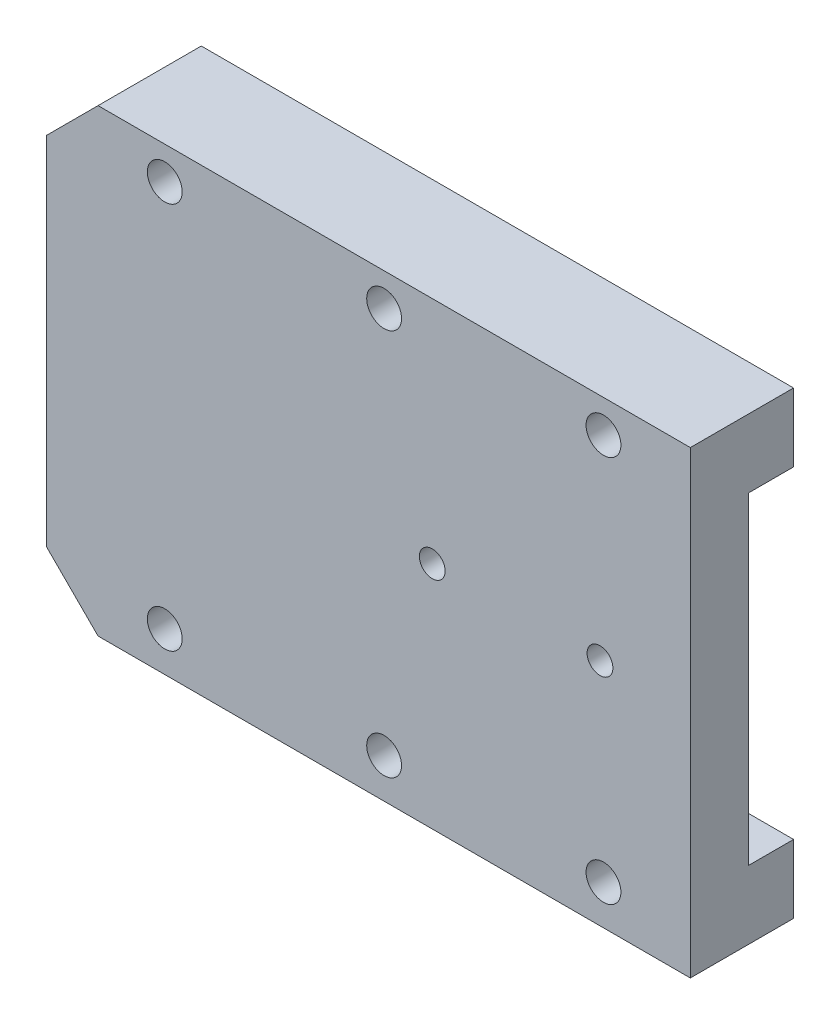
ISO-10303-21;
HEADER;
FILE_DESCRIPTION(('STEP AP214'),'2;1');
FILE_NAME('part.step','',(''),(''),'','','');
FILE_SCHEMA(('AUTOMOTIVE_DESIGN { 1 0 10303 214 1 1 1 1 }'));
ENDSEC;
DATA;
#1=APPLICATION_CONTEXT('core data for automotive mechanical design processes');
#2=APPLICATION_PROTOCOL_DEFINITION('international standard','automotive_design',2000,#1);
#3=PRODUCT_CONTEXT('',#1,'mechanical');
#4=PRODUCT('Part','Part','',(#3));
#5=PRODUCT_RELATED_PRODUCT_CATEGORY('part','',(#4));
#6=PRODUCT_DEFINITION_FORMATION('','',#4);
#7=PRODUCT_DEFINITION_CONTEXT('part definition',#1,'design');
#8=PRODUCT_DEFINITION('design','',#6,#7);
#9=PRODUCT_DEFINITION_SHAPE('','',#8);
#10=(LENGTH_UNIT() NAMED_UNIT(*) SI_UNIT(.MILLI.,.METRE.));
#11=(NAMED_UNIT(*) PLANE_ANGLE_UNIT() SI_UNIT($,.RADIAN.));
#12=(NAMED_UNIT(*) SI_UNIT($,.STERADIAN.) SOLID_ANGLE_UNIT());
#13=UNCERTAINTY_MEASURE_WITH_UNIT(LENGTH_MEASURE(1.E-05),#10,'distance_accuracy_value','');
#14=(GEOMETRIC_REPRESENTATION_CONTEXT(3) GLOBAL_UNCERTAINTY_ASSIGNED_CONTEXT((#13)) GLOBAL_UNIT_ASSIGNED_CONTEXT((#10,
#11,#12)) REPRESENTATION_CONTEXT('',''));
#15=CARTESIAN_POINT('',(0.,0.,0.));
#16=DIRECTION('',(0.,0.,1.));
#17=DIRECTION('',(1.,0.,0.));
#18=AXIS2_PLACEMENT_3D('',#15,#16,#17);
#19=CARTESIAN_POINT('',(0.,0.,-4.));
#20=DIRECTION('',(0.,0.,-1.));
#21=DIRECTION('',(-1.,0.,0.));
#22=AXIS2_PLACEMENT_3D('',#19,#20,#21);
#23=PLANE('',#22);
#24=DIRECTION('',(-1.,0.,0.));
#25=VECTOR('',#24,1.);
#26=CARTESIAN_POINT('',(22.5,12.5,-4.));
#27=LINE('',#26,#25);
#28=CARTESIAN_POINT('',(22.5,12.5,-4.));
#29=VERTEX_POINT('',#28);
#30=CARTESIAN_POINT('',(-27.4,12.5,-4.));
#31=VERTEX_POINT('',#30);
#32=EDGE_CURVE('E186',#29,#31,#27,.T.);
#33=ORIENTED_EDGE('',*,*,#32,.T.);
#34=DIRECTION('',(0.,1.,0.));
#35=VECTOR('',#34,1.);
#36=CARTESIAN_POINT('',(-27.4,17.8,-4.));
#37=LINE('',#36,#35);
#38=CARTESIAN_POINT('',(-27.4,13.8,-4.));
#39=VERTEX_POINT('',#38);
#40=EDGE_CURVE('E189',#31,#39,#37,.T.);
#41=ORIENTED_EDGE('',*,*,#40,.T.);
#42=DIRECTION('',(0.707106781186549,0.707106781186546,0.));
#43=VECTOR('',#42,1.);
#44=CARTESIAN_POINT('',(-20.6,20.6,-4.));
#45=LINE('',#44,#43);
#46=CARTESIAN_POINT('',(-23.4,17.8,-4.));
#47=VERTEX_POINT('',#46);
#48=EDGE_CURVE('E159',#39,#47,#45,.T.);
#49=ORIENTED_EDGE('',*,*,#48,.T.);
#50=DIRECTION('',(-1.,0.,0.));
#51=VECTOR('',#50,1.);
#52=CARTESIAN_POINT('',(22.5,17.8,-4.));
#53=LINE('',#52,#51);
#54=CARTESIAN_POINT('',(22.5,17.8,-4.));
#55=VERTEX_POINT('',#54);
#56=EDGE_CURVE('E137',#55,#47,#53,.T.);
#57=ORIENTED_EDGE('',*,*,#56,.F.);
#58=DIRECTION('',(0.,1.,0.));
#59=VECTOR('',#58,1.);
#60=CARTESIAN_POINT('',(22.5,17.8,-4.));
#61=LINE('',#60,#59);
#62=EDGE_CURVE('E138',#29,#55,#61,.T.);
#63=ORIENTED_EDGE('',*,*,#62,.F.);
#64=EDGE_LOOP('',(#33,#41,#49,#57,#63));
#65=FACE_BOUND('',#64,.T.);
#66=CARTESIAN_POINT('',(-18.2306151546301,15.2670988528399,-4.));
#67=DIRECTION('',(0.,0.,-1.));
#68=DIRECTION('',(-1.,0.,0.));
#69=AXIS2_PLACEMENT_3D('',#66,#67,#68);
#70=CIRCLE('',#69,1.35);
#71=CARTESIAN_POINT('',(-19.5806151546301,15.2670988528399,-4.));
#72=VERTEX_POINT('',#71);
#73=EDGE_CURVE('E206',#72,#72,#70,.T.);
#74=ORIENTED_EDGE('',*,*,#73,.F.);
#75=EDGE_LOOP('',(#74));
#76=FACE_BOUND('',#75,.T.);
#77=CARTESIAN_POINT('',(-1.23061515463011,15.2670988528399,-4.));
#78=DIRECTION('',(0.,0.,-1.));
#79=DIRECTION('',(-1.,0.,0.));
#80=AXIS2_PLACEMENT_3D('',#77,#78,#79);
#81=CIRCLE('',#80,1.35);
#82=CARTESIAN_POINT('',(-2.58061515463011,15.2670988528399,-4.));
#83=VERTEX_POINT('',#82);
#84=EDGE_CURVE('E200',#83,#83,#81,.T.);
#85=ORIENTED_EDGE('',*,*,#84,.F.);
#86=EDGE_LOOP('',(#85));
#87=FACE_BOUND('',#86,.T.);
#88=CARTESIAN_POINT('',(15.7693848453699,15.2670988528398,-4.));
#89=DIRECTION('',(0.,0.,-1.));
#90=DIRECTION('',(-1.,0.,0.));
#91=AXIS2_PLACEMENT_3D('',#88,#89,#90);
#92=CIRCLE('',#91,1.35);
#93=CARTESIAN_POINT('',(14.4193848453699,15.2670988528398,-4.));
#94=VERTEX_POINT('',#93);
#95=EDGE_CURVE('E195',#94,#94,#92,.T.);
#96=ORIENTED_EDGE('',*,*,#95,.F.);
#97=EDGE_LOOP('',(#96));
#98=FACE_BOUND('',#97,.T.);
#99=ADVANCED_FACE('F32',(#65,#76,#87,#98),#23,.T.);
#100=CARTESIAN_POINT('',(22.5,-17.8,4.));
#101=DIRECTION('',(0.,1.,0.));
#102=DIRECTION('',(-1.,0.,0.));
#103=AXIS2_PLACEMENT_3D('',#100,#101,#102);
#104=PLANE('',#103);
#105=DIRECTION('',(1.,0.,0.));
#106=VECTOR('',#105,1.);
#107=CARTESIAN_POINT('',(22.5,-17.8,4.));
#108=LINE('',#107,#106);
#109=CARTESIAN_POINT('',(-23.4,-17.8,4.));
#110=VERTEX_POINT('',#109);
#111=CARTESIAN_POINT('',(22.5,-17.8,4.));
#112=VERTEX_POINT('',#111);
#113=EDGE_CURVE('E141',#110,#112,#108,.T.);
#114=ORIENTED_EDGE('',*,*,#113,.F.);
#115=DIRECTION('',(0.,0.,-1.));
#116=VECTOR('',#115,1.);
#117=CARTESIAN_POINT('',(-23.4,-17.8,-4.));
#118=LINE('',#117,#116);
#119=CARTESIAN_POINT('',(-23.4,-17.8,-4.));
#120=VERTEX_POINT('',#119);
#121=EDGE_CURVE('E11',#110,#120,#118,.T.);
#122=ORIENTED_EDGE('',*,*,#121,.T.);
#123=DIRECTION('',(1.,0.,0.));
#124=VECTOR('',#123,1.);
#125=CARTESIAN_POINT('',(22.5,-17.8,-4.));
#126=LINE('',#125,#124);
#127=CARTESIAN_POINT('',(22.5,-17.8,-4.));
#128=VERTEX_POINT('',#127);
#129=EDGE_CURVE('E143',#120,#128,#126,.T.);
#130=ORIENTED_EDGE('',*,*,#129,.T.);
#131=DIRECTION('',(0.,0.,-1.));
#132=VECTOR('',#131,1.);
#133=CARTESIAN_POINT('',(22.5,-17.8,4.));
#134=LINE('',#133,#132);
#135=EDGE_CURVE('E136',#112,#128,#134,.T.);
#136=ORIENTED_EDGE('',*,*,#135,.F.);
#137=EDGE_LOOP('',(#114,#122,#130,#136));
#138=FACE_BOUND('',#137,.T.);
#139=ADVANCED_FACE('F254',(#138),#104,.F.);
#140=CARTESIAN_POINT('',(22.5,17.8,4.));
#141=DIRECTION('',(-1.,0.,0.));
#142=DIRECTION('',(0.,0.,1.));
#143=AXIS2_PLACEMENT_3D('',#140,#141,#142);
#144=PLANE('',#143);
#145=DIRECTION('',(0.,1.,0.));
#146=VECTOR('',#145,1.);
#147=CARTESIAN_POINT('',(22.5,12.5,-0.5));
#148=LINE('',#147,#146);
#149=CARTESIAN_POINT('',(22.5,-12.5,-0.499999999999997));
#150=VERTEX_POINT('',#149);
#151=CARTESIAN_POINT('',(22.5,12.5,-0.5));
#152=VERTEX_POINT('',#151);
#153=EDGE_CURVE('E118',#150,#152,#148,.T.);
#154=ORIENTED_EDGE('',*,*,#153,.T.);
#155=DIRECTION('',(0.,0.,-1.));
#156=VECTOR('',#155,1.);
#157=CARTESIAN_POINT('',(22.5,12.5,-0.5));
#158=LINE('',#157,#156);
#159=EDGE_CURVE('E130',#152,#29,#158,.T.);
#160=ORIENTED_EDGE('',*,*,#159,.T.);
#161=ORIENTED_EDGE('',*,*,#62,.T.);
#162=DIRECTION('',(0.,0.,-1.));
#163=VECTOR('',#162,1.);
#164=CARTESIAN_POINT('',(22.5,17.8,4.));
#165=LINE('',#164,#163);
#166=CARTESIAN_POINT('',(22.5,17.8,4.));
#167=VERTEX_POINT('',#166);
#168=EDGE_CURVE('E147',#167,#55,#165,.T.);
#169=ORIENTED_EDGE('',*,*,#168,.F.);
#170=DIRECTION('',(0.,1.,0.));
#171=VECTOR('',#170,1.);
#172=CARTESIAN_POINT('',(22.5,17.8,4.));
#173=LINE('',#172,#171);
#174=EDGE_CURVE('E233',#112,#167,#173,.T.);
#175=ORIENTED_EDGE('',*,*,#174,.F.);
#176=ORIENTED_EDGE('',*,*,#135,.T.);
#177=CARTESIAN_POINT('',(22.5,-12.5,-4.));
#178=VERTEX_POINT('',#177);
#179=EDGE_CURVE('E127',#128,#178,#61,.T.);
#180=ORIENTED_EDGE('',*,*,#179,.T.);
#181=DIRECTION('',(0.,0.,1.));
#182=VECTOR('',#181,1.);
#183=CARTESIAN_POINT('',(22.5,-12.5,-0.499999999999997));
#184=LINE('',#183,#182);
#185=EDGE_CURVE('E111',#178,#150,#184,.T.);
#186=ORIENTED_EDGE('',*,*,#185,.T.);
#187=EDGE_LOOP('',(#154,#160,#161,#169,#175,#176,#180,#186));
#188=FACE_BOUND('',#187,.T.);
#189=ADVANCED_FACE('F133',(#188),#144,.F.);
#190=CARTESIAN_POINT('',(22.5,17.8,4.));
#191=DIRECTION('',(0.,-1.,0.));
#192=DIRECTION('',(1.,0.,0.));
#193=AXIS2_PLACEMENT_3D('',#190,#191,#192);
#194=PLANE('',#193);
#195=ORIENTED_EDGE('',*,*,#56,.T.);
#196=DIRECTION('',(0.,0.,1.));
#197=VECTOR('',#196,1.);
#198=CARTESIAN_POINT('',(-23.4,17.8,4.));
#199=LINE('',#198,#197);
#200=CARTESIAN_POINT('',(-23.4,17.8,4.));
#201=VERTEX_POINT('',#200);
#202=EDGE_CURVE('E161',#47,#201,#199,.T.);
#203=ORIENTED_EDGE('',*,*,#202,.T.);
#204=DIRECTION('',(-1.,0.,0.));
#205=VECTOR('',#204,1.);
#206=CARTESIAN_POINT('',(22.5,17.8,4.));
#207=LINE('',#206,#205);
#208=EDGE_CURVE('E150',#167,#201,#207,.T.);
#209=ORIENTED_EDGE('',*,*,#208,.F.);
#210=ORIENTED_EDGE('',*,*,#168,.T.);
#211=EDGE_LOOP('',(#195,#203,#209,#210));
#212=FACE_BOUND('',#211,.T.);
#213=ADVANCED_FACE('F264',(#212),#194,.F.);
#214=CARTESIAN_POINT('',(0.,0.,4.));
#215=DIRECTION('',(0.,0.,-1.));
#216=DIRECTION('',(-1.,0.,0.));
#217=AXIS2_PLACEMENT_3D('',#214,#215,#216);
#218=PLANE('',#217);
#219=CARTESIAN_POINT('',(15.5,0.,4.));
#220=DIRECTION('',(0.,0.,1.));
#221=DIRECTION('',(1.,0.,0.));
#222=AXIS2_PLACEMENT_3D('',#219,#220,#221);
#223=CIRCLE('',#222,1.);
#224=CARTESIAN_POINT('',(16.5,0.,4.));
#225=VERTEX_POINT('',#224);
#226=EDGE_CURVE('E177',#225,#225,#223,.T.);
#227=ORIENTED_EDGE('',*,*,#226,.F.);
#228=EDGE_LOOP('',(#227));
#229=FACE_BOUND('',#228,.T.);
#230=CARTESIAN_POINT('',(2.49999999999999,0.,4.));
#231=DIRECTION('',(0.,0.,1.));
#232=DIRECTION('',(1.,0.,0.));
#233=AXIS2_PLACEMENT_3D('',#230,#231,#232);
#234=CIRCLE('',#233,1.);
#235=CARTESIAN_POINT('',(3.49999999999999,0.,4.));
#236=VERTEX_POINT('',#235);
#237=EDGE_CURVE('E167',#236,#236,#234,.T.);
#238=ORIENTED_EDGE('',*,*,#237,.F.);
#239=EDGE_LOOP('',(#238));
#240=FACE_BOUND('',#239,.T.);
#241=CARTESIAN_POINT('',(15.7693848453699,15.2670988528398,4.));
#242=DIRECTION('',(0.,0.,-1.));
#243=DIRECTION('',(-1.,0.,0.));
#244=AXIS2_PLACEMENT_3D('',#241,#242,#243);
#245=CIRCLE('',#244,1.35);
#246=CARTESIAN_POINT('',(14.4193848453699,15.2670988528398,4.));
#247=VERTEX_POINT('',#246);
#248=EDGE_CURVE('E197',#247,#247,#245,.T.);
#249=ORIENTED_EDGE('',*,*,#248,.T.);
#250=EDGE_LOOP('',(#249));
#251=FACE_BOUND('',#250,.T.);
#252=CARTESIAN_POINT('',(-1.23061515463011,15.2670988528399,4.));
#253=DIRECTION('',(0.,0.,-1.));
#254=DIRECTION('',(-1.,0.,0.));
#255=AXIS2_PLACEMENT_3D('',#252,#253,#254);
#256=CIRCLE('',#255,1.35);
#257=CARTESIAN_POINT('',(-2.58061515463011,15.2670988528399,4.));
#258=VERTEX_POINT('',#257);
#259=EDGE_CURVE('E203',#258,#258,#256,.T.);
#260=ORIENTED_EDGE('',*,*,#259,.T.);
#261=EDGE_LOOP('',(#260));
#262=FACE_BOUND('',#261,.T.);
#263=CARTESIAN_POINT('',(-18.2306151546301,15.2670988528399,4.));
#264=DIRECTION('',(0.,0.,-1.));
#265=DIRECTION('',(-1.,0.,0.));
#266=AXIS2_PLACEMENT_3D('',#263,#264,#265);
#267=CIRCLE('',#266,1.35);
#268=CARTESIAN_POINT('',(-19.5806151546301,15.2670988528399,4.));
#269=VERTEX_POINT('',#268);
#270=EDGE_CURVE('E209',#269,#269,#267,.T.);
#271=ORIENTED_EDGE('',*,*,#270,.T.);
#272=EDGE_LOOP('',(#271));
#273=FACE_BOUND('',#272,.T.);
#274=CARTESIAN_POINT('',(-18.2306151546302,-14.7329011471601,4.));
#275=DIRECTION('',(0.,0.,-1.));
#276=DIRECTION('',(-1.,0.,0.));
#277=AXIS2_PLACEMENT_3D('',#274,#275,#276);
#278=CIRCLE('',#277,1.35);
#279=CARTESIAN_POINT('',(-19.5806151546302,-14.7329011471601,4.));
#280=VERTEX_POINT('',#279);
#281=EDGE_CURVE('E215',#280,#280,#278,.T.);
#282=ORIENTED_EDGE('',*,*,#281,.T.);
#283=EDGE_LOOP('',(#282));
#284=FACE_BOUND('',#283,.T.);
#285=CARTESIAN_POINT('',(-1.23061515463022,-14.7329011471601,4.));
#286=DIRECTION('',(0.,0.,-1.));
#287=DIRECTION('',(-1.,0.,0.));
#288=AXIS2_PLACEMENT_3D('',#285,#286,#287);
#289=CIRCLE('',#288,1.35);
#290=CARTESIAN_POINT('',(-2.58061515463022,-14.7329011471601,4.));
#291=VERTEX_POINT('',#290);
#292=EDGE_CURVE('E221',#291,#291,#289,.T.);
#293=ORIENTED_EDGE('',*,*,#292,.T.);
#294=EDGE_LOOP('',(#293));
#295=FACE_BOUND('',#294,.T.);
#296=CARTESIAN_POINT('',(15.7693848453698,-14.7329011471602,4.));
#297=DIRECTION('',(0.,0.,-1.));
#298=DIRECTION('',(-1.,0.,0.));
#299=AXIS2_PLACEMENT_3D('',#296,#297,#298);
#300=CIRCLE('',#299,1.35);
#301=CARTESIAN_POINT('',(14.4193848453698,-14.7329011471602,4.));
#302=VERTEX_POINT('',#301);
#303=EDGE_CURVE('E227',#302,#302,#300,.T.);
#304=ORIENTED_EDGE('',*,*,#303,.T.);
#305=EDGE_LOOP('',(#304));
#306=FACE_BOUND('',#305,.T.);
#307=ORIENTED_EDGE('',*,*,#208,.T.);
#308=DIRECTION('',(-0.707106781186549,-0.707106781186546,0.));
#309=VECTOR('',#308,1.);
#310=CARTESIAN_POINT('',(-27.4,13.8,4.));
#311=LINE('',#310,#309);
#312=CARTESIAN_POINT('',(-27.4,13.8,4.));
#313=VERTEX_POINT('',#312);
#314=EDGE_CURVE('E41',#201,#313,#311,.T.);
#315=ORIENTED_EDGE('',*,*,#314,.T.);
#316=DIRECTION('',(0.,-1.,0.));
#317=VECTOR('',#316,1.);
#318=CARTESIAN_POINT('',(-27.4,17.8,4.));
#319=LINE('',#318,#317);
#320=CARTESIAN_POINT('',(-27.4,-13.8,4.));
#321=VERTEX_POINT('',#320);
#322=EDGE_CURVE('E193',#313,#321,#319,.T.);
#323=ORIENTED_EDGE('',*,*,#322,.T.);
#324=DIRECTION('',(0.707106781186547,-0.707106781186548,0.));
#325=VECTOR('',#324,1.);
#326=CARTESIAN_POINT('',(-23.4,-17.8,4.));
#327=LINE('',#326,#325);
#328=EDGE_CURVE('E57',#321,#110,#327,.T.);
#329=ORIENTED_EDGE('',*,*,#328,.T.);
#330=ORIENTED_EDGE('',*,*,#113,.T.);
#331=ORIENTED_EDGE('',*,*,#174,.T.);
#332=EDGE_LOOP('',(#307,#315,#323,#329,#330,#331));
#333=FACE_BOUND('',#332,.T.);
#334=ADVANCED_FACE('F237',(#229,#240,#251,#262,#273,#284,#295,#306,#333),#218,.F.);
#335=DIRECTION('',(-1.,0.,0.));
#336=VECTOR('',#335,1.);
#337=CARTESIAN_POINT('',(22.5,-12.5,-4.));
#338=LINE('',#337,#336);
#339=CARTESIAN_POINT('',(-27.4,-12.5,-4.));
#340=VERTEX_POINT('',#339);
#341=EDGE_CURVE('E49',#178,#340,#338,.T.);
#342=ORIENTED_EDGE('',*,*,#341,.F.);
#343=ORIENTED_EDGE('',*,*,#179,.F.);
#344=ORIENTED_EDGE('',*,*,#129,.F.);
#345=DIRECTION('',(-0.707106781186547,0.707106781186548,0.));
#346=VECTOR('',#345,1.);
#347=CARTESIAN_POINT('',(-20.6,-20.6,-4.));
#348=LINE('',#347,#346);
#349=CARTESIAN_POINT('',(-27.4,-13.8,-4.));
#350=VERTEX_POINT('',#349);
#351=EDGE_CURVE('E157',#120,#350,#348,.T.);
#352=ORIENTED_EDGE('',*,*,#351,.T.);
#353=EDGE_CURVE('E129',#350,#340,#37,.T.);
#354=ORIENTED_EDGE('',*,*,#353,.T.);
#355=EDGE_LOOP('',(#342,#343,#344,#352,#354));
#356=FACE_BOUND('',#355,.T.);
#357=CARTESIAN_POINT('',(-18.2306151546302,-14.7329011471601,-4.));
#358=DIRECTION('',(0.,0.,-1.));
#359=DIRECTION('',(-1.,0.,0.));
#360=AXIS2_PLACEMENT_3D('',#357,#358,#359);
#361=CIRCLE('',#360,1.35);
#362=CARTESIAN_POINT('',(-19.5806151546302,-14.7329011471601,-4.));
#363=VERTEX_POINT('',#362);
#364=EDGE_CURVE('E212',#363,#363,#361,.T.);
#365=ORIENTED_EDGE('',*,*,#364,.F.);
#366=EDGE_LOOP('',(#365));
#367=FACE_BOUND('',#366,.T.);
#368=CARTESIAN_POINT('',(-1.23061515463022,-14.7329011471601,-4.));
#369=DIRECTION('',(0.,0.,-1.));
#370=DIRECTION('',(-1.,0.,0.));
#371=AXIS2_PLACEMENT_3D('',#368,#369,#370);
#372=CIRCLE('',#371,1.35);
#373=CARTESIAN_POINT('',(-2.58061515463022,-14.7329011471601,-4.));
#374=VERTEX_POINT('',#373);
#375=EDGE_CURVE('E218',#374,#374,#372,.T.);
#376=ORIENTED_EDGE('',*,*,#375,.F.);
#377=EDGE_LOOP('',(#376));
#378=FACE_BOUND('',#377,.T.);
#379=CARTESIAN_POINT('',(15.7693848453698,-14.7329011471602,-4.));
#380=DIRECTION('',(0.,0.,-1.));
#381=DIRECTION('',(-1.,0.,0.));
#382=AXIS2_PLACEMENT_3D('',#379,#380,#381);
#383=CIRCLE('',#382,1.35);
#384=CARTESIAN_POINT('',(14.4193848453698,-14.7329011471602,-4.));
#385=VERTEX_POINT('',#384);
#386=EDGE_CURVE('E224',#385,#385,#383,.T.);
#387=ORIENTED_EDGE('',*,*,#386,.F.);
#388=EDGE_LOOP('',(#387));
#389=FACE_BOUND('',#388,.T.);
#390=ADVANCED_FACE('F124',(#356,#367,#378,#389),#23,.T.);
#391=CARTESIAN_POINT('',(15.7693848453698,-14.7329011471602,4.));
#392=DIRECTION('',(0.,0.,-1.));
#393=DIRECTION('',(-1.,0.,0.));
#394=AXIS2_PLACEMENT_3D('',#391,#392,#393);
#395=CYLINDRICAL_SURFACE('',#394,1.35);
#396=ORIENTED_EDGE('',*,*,#303,.F.);
#397=EDGE_LOOP('',(#396));
#398=FACE_BOUND('',#397,.T.);
#399=ORIENTED_EDGE('',*,*,#386,.T.);
#400=EDGE_LOOP('',(#399));
#401=FACE_BOUND('',#400,.T.);
#402=ADVANCED_FACE('F281',(#398,#401),#395,.F.);
#403=CARTESIAN_POINT('',(-1.23061515463022,-14.7329011471601,4.));
#404=DIRECTION('',(0.,0.,-1.));
#405=DIRECTION('',(-1.,0.,0.));
#406=AXIS2_PLACEMENT_3D('',#403,#404,#405);
#407=CYLINDRICAL_SURFACE('',#406,1.35);
#408=ORIENTED_EDGE('',*,*,#292,.F.);
#409=EDGE_LOOP('',(#408));
#410=FACE_BOUND('',#409,.T.);
#411=ORIENTED_EDGE('',*,*,#375,.T.);
#412=EDGE_LOOP('',(#411));
#413=FACE_BOUND('',#412,.T.);
#414=ADVANCED_FACE('F285',(#410,#413),#407,.F.);
#415=CARTESIAN_POINT('',(-18.2306151546302,-14.7329011471601,4.));
#416=DIRECTION('',(0.,0.,-1.));
#417=DIRECTION('',(-1.,0.,0.));
#418=AXIS2_PLACEMENT_3D('',#415,#416,#417);
#419=CYLINDRICAL_SURFACE('',#418,1.35);
#420=ORIENTED_EDGE('',*,*,#281,.F.);
#421=EDGE_LOOP('',(#420));
#422=FACE_BOUND('',#421,.T.);
#423=ORIENTED_EDGE('',*,*,#364,.T.);
#424=EDGE_LOOP('',(#423));
#425=FACE_BOUND('',#424,.T.);
#426=ADVANCED_FACE('F291',(#422,#425),#419,.F.);
#427=CARTESIAN_POINT('',(-18.2306151546301,15.2670988528399,4.));
#428=DIRECTION('',(0.,0.,-1.));
#429=DIRECTION('',(-1.,0.,0.));
#430=AXIS2_PLACEMENT_3D('',#427,#428,#429);
#431=CYLINDRICAL_SURFACE('',#430,1.35);
#432=ORIENTED_EDGE('',*,*,#270,.F.);
#433=EDGE_LOOP('',(#432));
#434=FACE_BOUND('',#433,.T.);
#435=ORIENTED_EDGE('',*,*,#73,.T.);
#436=EDGE_LOOP('',(#435));
#437=FACE_BOUND('',#436,.T.);
#438=ADVANCED_FACE('F299',(#434,#437),#431,.F.);
#439=CARTESIAN_POINT('',(-1.23061515463011,15.2670988528399,4.));
#440=DIRECTION('',(0.,0.,-1.));
#441=DIRECTION('',(-1.,0.,0.));
#442=AXIS2_PLACEMENT_3D('',#439,#440,#441);
#443=CYLINDRICAL_SURFACE('',#442,1.35);
#444=ORIENTED_EDGE('',*,*,#259,.F.);
#445=EDGE_LOOP('',(#444));
#446=FACE_BOUND('',#445,.T.);
#447=ORIENTED_EDGE('',*,*,#84,.T.);
#448=EDGE_LOOP('',(#447));
#449=FACE_BOUND('',#448,.T.);
#450=ADVANCED_FACE('F303',(#446,#449),#443,.F.);
#451=CARTESIAN_POINT('',(15.7693848453699,15.2670988528398,4.));
#452=DIRECTION('',(0.,0.,-1.));
#453=DIRECTION('',(-1.,0.,0.));
#454=AXIS2_PLACEMENT_3D('',#451,#452,#453);
#455=CYLINDRICAL_SURFACE('',#454,1.35);
#456=ORIENTED_EDGE('',*,*,#248,.F.);
#457=EDGE_LOOP('',(#456));
#458=FACE_BOUND('',#457,.T.);
#459=ORIENTED_EDGE('',*,*,#95,.T.);
#460=EDGE_LOOP('',(#459));
#461=FACE_BOUND('',#460,.T.);
#462=ADVANCED_FACE('F307',(#458,#461),#455,.F.);
#463=CARTESIAN_POINT('',(-27.4,17.8,39.935636908228));
#464=DIRECTION('',(-1.,0.,0.));
#465=DIRECTION('',(0.,-1.,0.));
#466=AXIS2_PLACEMENT_3D('',#463,#464,#465);
#467=PLANE('',#466);
#468=DIRECTION('',(0.,0.,-1.));
#469=VECTOR('',#468,1.);
#470=CARTESIAN_POINT('',(-27.4,12.5,-0.5));
#471=LINE('',#470,#469);
#472=CARTESIAN_POINT('',(-27.4,12.5,-0.5));
#473=VERTEX_POINT('',#472);
#474=EDGE_CURVE('E119',#473,#31,#471,.T.);
#475=ORIENTED_EDGE('',*,*,#474,.F.);
#476=DIRECTION('',(0.,1.,0.));
#477=VECTOR('',#476,1.);
#478=CARTESIAN_POINT('',(-27.4,12.5,-0.5));
#479=LINE('',#478,#477);
#480=CARTESIAN_POINT('',(-27.4,-12.5,-0.499999999999997));
#481=VERTEX_POINT('',#480);
#482=EDGE_CURVE('E170',#481,#473,#479,.T.);
#483=ORIENTED_EDGE('',*,*,#482,.F.);
#484=DIRECTION('',(0.,0.,1.));
#485=VECTOR('',#484,1.);
#486=CARTESIAN_POINT('',(-27.4,-12.5,-0.499999999999997));
#487=LINE('',#486,#485);
#488=EDGE_CURVE('E166',#340,#481,#487,.T.);
#489=ORIENTED_EDGE('',*,*,#488,.F.);
#490=ORIENTED_EDGE('',*,*,#353,.F.);
#491=DIRECTION('',(0.,0.,1.));
#492=VECTOR('',#491,1.);
#493=CARTESIAN_POINT('',(-27.4,-13.8,4.));
#494=LINE('',#493,#492);
#495=EDGE_CURVE('E152',#350,#321,#494,.T.);
#496=ORIENTED_EDGE('',*,*,#495,.T.);
#497=ORIENTED_EDGE('',*,*,#322,.F.);
#498=DIRECTION('',(0.,0.,-1.));
#499=VECTOR('',#498,1.);
#500=CARTESIAN_POINT('',(-27.4,13.8,-4.));
#501=LINE('',#500,#499);
#502=EDGE_CURVE('E154',#313,#39,#501,.T.);
#503=ORIENTED_EDGE('',*,*,#502,.T.);
#504=ORIENTED_EDGE('',*,*,#40,.F.);
#505=EDGE_LOOP('',(#475,#483,#489,#490,#496,#497,#503,#504));
#506=FACE_BOUND('',#505,.T.);
#507=ADVANCED_FACE('F249',(#506),#467,.T.);
#508=CARTESIAN_POINT('',(-27.4,13.8,39.935636908228));
#509=DIRECTION('',(-0.707106781186546,0.707106781186549,0.));
#510=DIRECTION('',(0.,0.,1.));
#511=AXIS2_PLACEMENT_3D('',#508,#509,#510);
#512=PLANE('',#511);
#513=ORIENTED_EDGE('',*,*,#314,.F.);
#514=ORIENTED_EDGE('',*,*,#202,.F.);
#515=ORIENTED_EDGE('',*,*,#48,.F.);
#516=ORIENTED_EDGE('',*,*,#502,.F.);
#517=EDGE_LOOP('',(#513,#514,#515,#516));
#518=FACE_BOUND('',#517,.T.);
#519=ADVANCED_FACE('F244',(#518),#512,.T.);
#520=CARTESIAN_POINT('',(-23.4,-17.8,4.));
#521=DIRECTION('',(-0.707106781186548,-0.707106781186547,0.));
#522=DIRECTION('',(0.,0.,1.));
#523=AXIS2_PLACEMENT_3D('',#520,#521,#522);
#524=PLANE('',#523);
#525=ORIENTED_EDGE('',*,*,#328,.F.);
#526=ORIENTED_EDGE('',*,*,#495,.F.);
#527=ORIENTED_EDGE('',*,*,#351,.F.);
#528=ORIENTED_EDGE('',*,*,#121,.F.);
#529=EDGE_LOOP('',(#525,#526,#527,#528));
#530=FACE_BOUND('',#529,.T.);
#531=ADVANCED_FACE('F34',(#530),#524,.T.);
#532=CARTESIAN_POINT('',(22.5,12.5,-0.5));
#533=DIRECTION('',(0.,1.,0.));
#534=DIRECTION('',(-1.,0.,0.));
#535=AXIS2_PLACEMENT_3D('',#532,#533,#534);
#536=PLANE('',#535);
#537=ORIENTED_EDGE('',*,*,#474,.T.);
#538=ORIENTED_EDGE('',*,*,#32,.F.);
#539=ORIENTED_EDGE('',*,*,#159,.F.);
#540=DIRECTION('',(-1.,0.,0.));
#541=VECTOR('',#540,1.);
#542=CARTESIAN_POINT('',(22.5,12.5,-0.5));
#543=LINE('',#542,#541);
#544=EDGE_CURVE('E190',#152,#473,#543,.T.);
#545=ORIENTED_EDGE('',*,*,#544,.T.);
#546=EDGE_LOOP('',(#537,#538,#539,#545));
#547=FACE_BOUND('',#546,.T.);
#548=ADVANCED_FACE('F319',(#547),#536,.F.);
#549=CARTESIAN_POINT('',(22.5,12.5,-0.5));
#550=DIRECTION('',(0.,0.,1.));
#551=DIRECTION('',(0.,-1.,0.));
#552=AXIS2_PLACEMENT_3D('',#549,#550,#551);
#553=PLANE('',#552);
#554=CARTESIAN_POINT('',(15.5,0.,-0.499999999999999));
#555=DIRECTION('',(0.,0.,1.));
#556=DIRECTION('',(0.,-1.,0.));
#557=AXIS2_PLACEMENT_3D('',#554,#555,#556);
#558=CIRCLE('',#557,1.);
#559=CARTESIAN_POINT('',(15.5,-1.,-0.499999999999999));
#560=VERTEX_POINT('',#559);
#561=EDGE_CURVE('E36',#560,#560,#558,.T.);
#562=ORIENTED_EDGE('',*,*,#561,.T.);
#563=EDGE_LOOP('',(#562));
#564=FACE_BOUND('',#563,.T.);
#565=CARTESIAN_POINT('',(2.49999999999999,0.,-0.499999999999998));
#566=DIRECTION('',(0.,0.,1.));
#567=DIRECTION('',(0.,-1.,0.));
#568=AXIS2_PLACEMENT_3D('',#565,#566,#567);
#569=CIRCLE('',#568,1.);
#570=CARTESIAN_POINT('',(2.49999999999999,-1.,-0.499999999999998));
#571=VERTEX_POINT('',#570);
#572=EDGE_CURVE('E164',#571,#571,#569,.T.);
#573=ORIENTED_EDGE('',*,*,#572,.T.);
#574=EDGE_LOOP('',(#573));
#575=FACE_BOUND('',#574,.T.);
#576=ORIENTED_EDGE('',*,*,#482,.T.);
#577=ORIENTED_EDGE('',*,*,#544,.F.);
#578=ORIENTED_EDGE('',*,*,#153,.F.);
#579=DIRECTION('',(-1.,0.,0.));
#580=VECTOR('',#579,1.);
#581=CARTESIAN_POINT('',(22.5,-12.5,-0.499999999999997));
#582=LINE('',#581,#580);
#583=EDGE_CURVE('E113',#150,#481,#582,.T.);
#584=ORIENTED_EDGE('',*,*,#583,.T.);
#585=EDGE_LOOP('',(#576,#577,#578,#584));
#586=FACE_BOUND('',#585,.T.);
#587=ADVANCED_FACE('F257',(#564,#575,#586),#553,.F.);
#588=CARTESIAN_POINT('',(22.5,-12.5,-0.499999999999997));
#589=DIRECTION('',(0.,-1.,0.));
#590=DIRECTION('',(1.,0.,0.));
#591=AXIS2_PLACEMENT_3D('',#588,#589,#590);
#592=PLANE('',#591);
#593=ORIENTED_EDGE('',*,*,#488,.T.);
#594=ORIENTED_EDGE('',*,*,#583,.F.);
#595=ORIENTED_EDGE('',*,*,#185,.F.);
#596=ORIENTED_EDGE('',*,*,#341,.T.);
#597=EDGE_LOOP('',(#593,#594,#595,#596));
#598=FACE_BOUND('',#597,.T.);
#599=ADVANCED_FACE('F112',(#598),#592,.F.);
#600=CARTESIAN_POINT('',(2.49999999999999,0.,-4.));
#601=DIRECTION('',(0.,0.,1.));
#602=DIRECTION('',(1.,0.,0.));
#603=AXIS2_PLACEMENT_3D('',#600,#601,#602);
#604=CYLINDRICAL_SURFACE('',#603,1.);
#605=ORIENTED_EDGE('',*,*,#237,.T.);
#606=EDGE_LOOP('',(#605));
#607=FACE_BOUND('',#606,.T.);
#608=ORIENTED_EDGE('',*,*,#572,.F.);
#609=EDGE_LOOP('',(#608));
#610=FACE_BOUND('',#609,.T.);
#611=ADVANCED_FACE('F316',(#607,#610),#604,.F.);
#612=CARTESIAN_POINT('',(15.5,0.,-4.));
#613=DIRECTION('',(0.,0.,1.));
#614=DIRECTION('',(1.,0.,0.));
#615=AXIS2_PLACEMENT_3D('',#612,#613,#614);
#616=CYLINDRICAL_SURFACE('',#615,1.);
#617=ORIENTED_EDGE('',*,*,#226,.T.);
#618=EDGE_LOOP('',(#617));
#619=FACE_BOUND('',#618,.T.);
#620=ORIENTED_EDGE('',*,*,#561,.F.);
#621=EDGE_LOOP('',(#620));
#622=FACE_BOUND('',#621,.T.);
#623=ADVANCED_FACE('F325',(#619,#622),#616,.F.);
#624=CLOSED_SHELL('',(#99,#139,#189,#213,#334,#390,#402,#414,#426,#438,#450,#462,#507,#519,#531,
#548,#587,#599,#611,#623));
#625=MANIFOLD_SOLID_BREP('B2',#624);
#626=ADVANCED_BREP_SHAPE_REPRESENTATION('',(#18,#625),#14);
#627=SHAPE_DEFINITION_REPRESENTATION(#9,#626);
ENDSEC;
END-ISO-10303-21;
